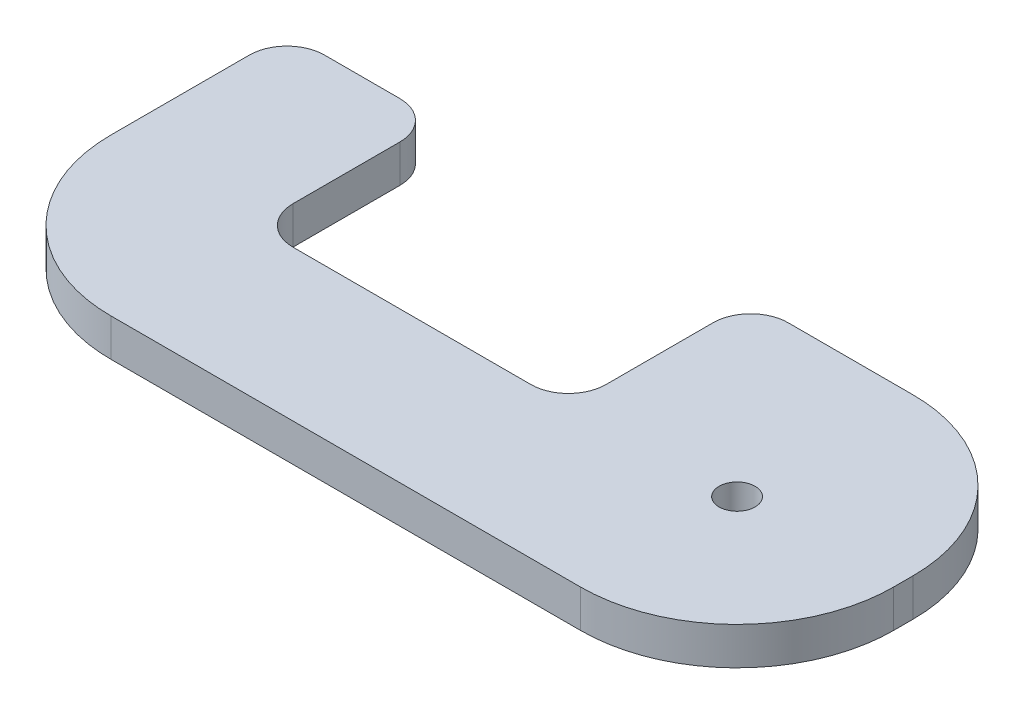
ISO-10303-21;
HEADER;
FILE_DESCRIPTION(('STEP AP214'),'2;1');
FILE_NAME('part.step','',(''),(''),'','','');
FILE_SCHEMA(('AUTOMOTIVE_DESIGN { 1 0 10303 214 1 1 1 1 }'));
ENDSEC;
DATA;
#1=APPLICATION_CONTEXT('core data for automotive mechanical design processes');
#2=APPLICATION_PROTOCOL_DEFINITION('international standard','automotive_design',2000,#1);
#3=PRODUCT_CONTEXT('',#1,'mechanical');
#4=PRODUCT('Part','Part','',(#3));
#5=PRODUCT_RELATED_PRODUCT_CATEGORY('part','',(#4));
#6=PRODUCT_DEFINITION_FORMATION('','',#4);
#7=PRODUCT_DEFINITION_CONTEXT('part definition',#1,'design');
#8=PRODUCT_DEFINITION('design','',#6,#7);
#9=PRODUCT_DEFINITION_SHAPE('','',#8);
#10=(LENGTH_UNIT() NAMED_UNIT(*) SI_UNIT(.MILLI.,.METRE.));
#11=(NAMED_UNIT(*) PLANE_ANGLE_UNIT() SI_UNIT($,.RADIAN.));
#12=(NAMED_UNIT(*) SI_UNIT($,.STERADIAN.) SOLID_ANGLE_UNIT());
#13=UNCERTAINTY_MEASURE_WITH_UNIT(LENGTH_MEASURE(1.E-05),#10,'distance_accuracy_value','');
#14=(GEOMETRIC_REPRESENTATION_CONTEXT(3) GLOBAL_UNCERTAINTY_ASSIGNED_CONTEXT((#13)) GLOBAL_UNIT_ASSIGNED_CONTEXT((#10,
#11,#12)) REPRESENTATION_CONTEXT('',''));
#15=CARTESIAN_POINT('',(0.,0.,0.));
#16=DIRECTION('',(0.,0.,1.));
#17=DIRECTION('',(1.,0.,0.));
#18=AXIS2_PLACEMENT_3D('',#15,#16,#17);
#19=CARTESIAN_POINT('',(-32.8511120004048,3.175,-13.9774845085755));
#20=DIRECTION('',(0.,0.,1.));
#21=DIRECTION('',(1.,0.,0.));
#22=AXIS2_PLACEMENT_3D('',#19,#20,#21);
#23=PLANE('',#22);
#24=DIRECTION('',(-1.,0.,0.));
#25=VECTOR('',#24,1.);
#26=CARTESIAN_POINT('',(-32.8511120004048,0.,-13.9774845085755));
#27=LINE('',#26,#25);
#28=CARTESIAN_POINT('',(19.9808879995952,0.,-13.9774845085755));
#29=VERTEX_POINT('',#28);
#30=CARTESIAN_POINT('',(9.43988799959521,0.,-13.9774845085755));
#31=VERTEX_POINT('',#30);
#32=EDGE_CURVE('E162',#29,#31,#27,.T.);
#33=ORIENTED_EDGE('',*,*,#32,.T.);
#34=DIRECTION('',(0.,1.,0.));
#35=VECTOR('',#34,1.);
#36=CARTESIAN_POINT('',(9.43988799959521,3.175,-13.9774845085755));
#37=LINE('',#36,#35);
#38=CARTESIAN_POINT('',(9.43988799959521,3.175,-13.9774845085755));
#39=VERTEX_POINT('',#38);
#40=EDGE_CURVE('E253',#31,#39,#37,.T.);
#41=ORIENTED_EDGE('',*,*,#40,.T.);
#42=DIRECTION('',(-1.,0.,0.));
#43=VECTOR('',#42,1.);
#44=CARTESIAN_POINT('',(-32.8511120004048,3.175,-13.9774845085755));
#45=LINE('',#44,#43);
#46=CARTESIAN_POINT('',(19.9808879995952,3.175,-13.9774845085755));
#47=VERTEX_POINT('',#46);
#48=EDGE_CURVE('E209',#47,#39,#45,.T.);
#49=ORIENTED_EDGE('',*,*,#48,.F.);
#50=DIRECTION('',(0.,-1.,0.));
#51=VECTOR('',#50,1.);
#52=CARTESIAN_POINT('',(19.9808879995952,3.175,-13.9774845085755));
#53=LINE('',#52,#51);
#54=EDGE_CURVE('E180',#47,#29,#53,.T.);
#55=ORIENTED_EDGE('',*,*,#54,.T.);
#56=EDGE_LOOP('',(#33,#41,#49,#55));
#57=FACE_BOUND('',#56,.T.);
#58=ADVANCED_FACE('F34',(#57),#23,.F.);
#59=CARTESIAN_POINT('',(-32.8511120004048,3.175,-13.9774845085755));
#60=DIRECTION('',(1.,0.,0.));
#61=DIRECTION('',(0.,0.,-1.));
#62=AXIS2_PLACEMENT_3D('',#59,#60,#61);
#63=PLANE('',#62);
#64=DIRECTION('',(0.,0.,1.));
#65=VECTOR('',#64,1.);
#66=CARTESIAN_POINT('',(-32.8511120004048,3.175,-13.9774845085755));
#67=LINE('',#66,#65);
#68=CARTESIAN_POINT('',(-32.8511120004048,3.175,-10.8024845085755));
#69=VERTEX_POINT('',#68);
#70=CARTESIAN_POINT('',(-32.8511120004048,3.175,0.881515491424525));
#71=VERTEX_POINT('',#70);
#72=EDGE_CURVE('E146',#69,#71,#67,.T.);
#73=ORIENTED_EDGE('',*,*,#72,.F.);
#74=DIRECTION('',(0.,-1.,0.));
#75=VECTOR('',#74,1.);
#76=CARTESIAN_POINT('',(-32.8511120004048,3.175,-10.8024845085755));
#77=LINE('',#76,#75);
#78=CARTESIAN_POINT('',(-32.8511120004048,0.,-10.8024845085755));
#79=VERTEX_POINT('',#78);
#80=EDGE_CURVE('E269',#69,#79,#77,.T.);
#81=ORIENTED_EDGE('',*,*,#80,.T.);
#82=DIRECTION('',(0.,0.,1.));
#83=VECTOR('',#82,1.);
#84=CARTESIAN_POINT('',(-32.8511120004048,0.,-13.9774845085755));
#85=LINE('',#84,#83);
#86=CARTESIAN_POINT('',(-32.8511120004048,0.,0.881515491424525));
#87=VERTEX_POINT('',#86);
#88=EDGE_CURVE('E167',#79,#87,#85,.T.);
#89=ORIENTED_EDGE('',*,*,#88,.T.);
#90=DIRECTION('',(0.,-1.,0.));
#91=VECTOR('',#90,1.);
#92=CARTESIAN_POINT('',(-32.8511120004048,3.175,0.881515491424525));
#93=LINE('',#92,#91);
#94=EDGE_CURVE('E165',#87,#71,#93,.F.);
#95=ORIENTED_EDGE('',*,*,#94,.T.);
#96=EDGE_LOOP('',(#73,#81,#89,#95));
#97=FACE_BOUND('',#96,.T.);
#98=ADVANCED_FACE('F166',(#97),#63,.F.);
#99=CARTESIAN_POINT('',(-32.8511120004048,3.175,14.0895154914245));
#100=DIRECTION('',(0.,0.,-1.));
#101=DIRECTION('',(-1.,0.,0.));
#102=AXIS2_PLACEMENT_3D('',#99,#100,#101);
#103=PLANE('',#102);
#104=DIRECTION('',(1.,0.,0.));
#105=VECTOR('',#104,1.);
#106=CARTESIAN_POINT('',(-32.8511120004048,3.175,14.0895154914245));
#107=LINE('',#106,#105);
#108=CARTESIAN_POINT('',(-19.6431120004048,3.175,14.0895154914245));
#109=VERTEX_POINT('',#108);
#110=CARTESIAN_POINT('',(19.9808879995952,3.175,14.0895154914245));
#111=VERTEX_POINT('',#110);
#112=EDGE_CURVE('E161',#109,#111,#107,.T.);
#113=ORIENTED_EDGE('',*,*,#112,.F.);
#114=DIRECTION('',(0.,-1.,0.));
#115=VECTOR('',#114,1.);
#116=CARTESIAN_POINT('',(-19.6431120004048,3.175,14.0895154914245));
#117=LINE('',#116,#115);
#118=CARTESIAN_POINT('',(-19.6431120004048,0.,14.0895154914245));
#119=VERTEX_POINT('',#118);
#120=EDGE_CURVE('E176',#109,#119,#117,.T.);
#121=ORIENTED_EDGE('',*,*,#120,.T.);
#122=DIRECTION('',(1.,0.,0.));
#123=VECTOR('',#122,1.);
#124=CARTESIAN_POINT('',(-32.8511120004048,0.,14.0895154914245));
#125=LINE('',#124,#123);
#126=CARTESIAN_POINT('',(19.9808879995952,0.,14.0895154914245));
#127=VERTEX_POINT('',#126);
#128=EDGE_CURVE('E204',#119,#127,#125,.T.);
#129=ORIENTED_EDGE('',*,*,#128,.T.);
#130=DIRECTION('',(0.,-1.,0.));
#131=VECTOR('',#130,1.);
#132=CARTESIAN_POINT('',(19.9808879995952,3.175,14.0895154914245));
#133=LINE('',#132,#131);
#134=EDGE_CURVE('E203',#127,#111,#133,.F.);
#135=ORIENTED_EDGE('',*,*,#134,.T.);
#136=EDGE_LOOP('',(#113,#121,#129,#135));
#137=FACE_BOUND('',#136,.T.);
#138=ADVANCED_FACE('F326',(#137),#103,.F.);
#139=CARTESIAN_POINT('',(33.1888879995952,3.175,-13.9774845085755));
#140=DIRECTION('',(-1.,0.,0.));
#141=DIRECTION('',(0.,0.,1.));
#142=AXIS2_PLACEMENT_3D('',#139,#140,#141);
#143=PLANE('',#142);
#144=DIRECTION('',(0.,0.,-1.));
#145=VECTOR('',#144,1.);
#146=CARTESIAN_POINT('',(33.1888879995952,0.,-13.9774845085755));
#147=LINE('',#146,#145);
#148=CARTESIAN_POINT('',(33.1888879995952,0.,0.881515491424518));
#149=VERTEX_POINT('',#148);
#150=CARTESIAN_POINT('',(33.1888879995952,0.,-0.76948450857548));
#151=VERTEX_POINT('',#150);
#152=EDGE_CURVE('E207',#149,#151,#147,.T.);
#153=ORIENTED_EDGE('',*,*,#152,.T.);
#154=DIRECTION('',(0.,-1.,0.));
#155=VECTOR('',#154,1.);
#156=CARTESIAN_POINT('',(33.1888879995952,3.175,-0.76948450857548));
#157=LINE('',#156,#155);
#158=CARTESIAN_POINT('',(33.1888879995952,3.175,-0.76948450857548));
#159=VERTEX_POINT('',#158);
#160=EDGE_CURVE('E218',#151,#159,#157,.F.);
#161=ORIENTED_EDGE('',*,*,#160,.T.);
#162=DIRECTION('',(0.,0.,-1.));
#163=VECTOR('',#162,1.);
#164=CARTESIAN_POINT('',(33.1888879995952,3.175,-13.9774845085755));
#165=LINE('',#164,#163);
#166=CARTESIAN_POINT('',(33.1888879995952,3.175,0.881515491424518));
#167=VERTEX_POINT('',#166);
#168=EDGE_CURVE('E194',#167,#159,#165,.T.);
#169=ORIENTED_EDGE('',*,*,#168,.F.);
#170=DIRECTION('',(0.,-1.,0.));
#171=VECTOR('',#170,1.);
#172=CARTESIAN_POINT('',(33.1888879995952,3.175,0.881515491424518));
#173=LINE('',#172,#171);
#174=EDGE_CURVE('E177',#167,#149,#173,.T.);
#175=ORIENTED_EDGE('',*,*,#174,.T.);
#176=EDGE_LOOP('',(#153,#161,#169,#175));
#177=FACE_BOUND('',#176,.T.);
#178=ADVANCED_FACE('F334',(#177),#143,.F.);
#179=CARTESIAN_POINT('',(-23.3261120004048,3.175,-13.9774845085755));
#180=VERTEX_POINT('',#179);
#181=CARTESIAN_POINT('',(-29.6761120004048,3.175,-13.9774845085755));
#182=VERTEX_POINT('',#181);
#183=EDGE_CURVE('E312',#180,#182,#45,.T.);
#184=ORIENTED_EDGE('',*,*,#183,.F.);
#185=DIRECTION('',(0.,1.,0.));
#186=VECTOR('',#185,1.);
#187=CARTESIAN_POINT('',(-23.3261120004048,3.175,-13.9774845085755));
#188=LINE('',#187,#186);
#189=CARTESIAN_POINT('',(-23.3261120004048,0.,-13.9774845085755));
#190=VERTEX_POINT('',#189);
#191=EDGE_CURVE('E56',#180,#190,#188,.F.);
#192=ORIENTED_EDGE('',*,*,#191,.T.);
#193=CARTESIAN_POINT('',(-29.6761120004048,0.,-13.9774845085755));
#194=VERTEX_POINT('',#193);
#195=EDGE_CURVE('E224',#190,#194,#27,.T.);
#196=ORIENTED_EDGE('',*,*,#195,.T.);
#197=DIRECTION('',(0.,-1.,0.));
#198=VECTOR('',#197,1.);
#199=CARTESIAN_POINT('',(-29.6761120004048,3.175,-13.9774845085755));
#200=LINE('',#199,#198);
#201=EDGE_CURVE('E266',#194,#182,#200,.F.);
#202=ORIENTED_EDGE('',*,*,#201,.T.);
#203=EDGE_LOOP('',(#184,#192,#196,#202));
#204=FACE_BOUND('',#203,.T.);
#205=ADVANCED_FACE('F357',(#204),#23,.F.);
#206=CARTESIAN_POINT('',(0.1688879995952,3.175,0.0560154914245228));
#207=DIRECTION('',(0.,1.,0.));
#208=DIRECTION('',(0.,0.,1.));
#209=AXIS2_PLACEMENT_3D('',#206,#207,#208);
#210=PLANE('',#209);
#211=ORIENTED_EDGE('',*,*,#48,.T.);
#212=CARTESIAN_POINT('',(9.43988799959521,3.175,-10.8024845085755));
#213=DIRECTION('',(0.,1.,0.));
#214=DIRECTION('',(0.,0.,1.));
#215=AXIS2_PLACEMENT_3D('',#212,#213,#214);
#216=CIRCLE('',#215,3.175);
#217=CARTESIAN_POINT('',(6.26488799959521,3.175,-10.8024845085755));
#218=VERTEX_POINT('',#217);
#219=EDGE_CURVE('E259',#39,#218,#216,.T.);
#220=ORIENTED_EDGE('',*,*,#219,.T.);
#221=DIRECTION('',(0.,0.,-1.));
#222=VECTOR('',#221,1.);
#223=CARTESIAN_POINT('',(6.26488799959521,3.175,-13.9774845085755));
#224=LINE('',#223,#222);
#225=CARTESIAN_POINT('',(6.26488799959521,3.175,-1.78548450857548));
#226=VERTEX_POINT('',#225);
#227=EDGE_CURVE('E279',#226,#218,#224,.T.);
#228=ORIENTED_EDGE('',*,*,#227,.F.);
#229=CARTESIAN_POINT('',(3.08988799959521,3.175,-1.78548450857548));
#230=DIRECTION('',(0.,1.,0.));
#231=DIRECTION('',(0.,0.,1.));
#232=AXIS2_PLACEMENT_3D('',#229,#230,#231);
#233=CIRCLE('',#232,3.175);
#234=CARTESIAN_POINT('',(3.08988799959521,3.175,1.38951549142452));
#235=VERTEX_POINT('',#234);
#236=EDGE_CURVE('E42',#226,#235,#233,.F.);
#237=ORIENTED_EDGE('',*,*,#236,.T.);
#238=DIRECTION('',(1.,0.,0.));
#239=VECTOR('',#238,1.);
#240=CARTESIAN_POINT('',(6.26488799959521,3.175,1.38951549142452));
#241=LINE('',#240,#239);
#242=CARTESIAN_POINT('',(-16.9761120004048,3.175,1.38951549142452));
#243=VERTEX_POINT('',#242);
#244=EDGE_CURVE('E277',#243,#235,#241,.T.);
#245=ORIENTED_EDGE('',*,*,#244,.F.);
#246=CARTESIAN_POINT('',(-16.9761120004048,3.175,-1.78548450857548));
#247=DIRECTION('',(0.,1.,0.));
#248=DIRECTION('',(0.,0.,1.));
#249=AXIS2_PLACEMENT_3D('',#246,#247,#248);
#250=CIRCLE('',#249,3.175);
#251=CARTESIAN_POINT('',(-20.1511120004048,3.175,-1.78548450857547));
#252=VERTEX_POINT('',#251);
#253=EDGE_CURVE('E271',#243,#252,#250,.F.);
#254=ORIENTED_EDGE('',*,*,#253,.T.);
#255=DIRECTION('',(0.,0.,1.));
#256=VECTOR('',#255,1.);
#257=CARTESIAN_POINT('',(-20.1511120004048,3.175,-13.9774845085755));
#258=LINE('',#257,#256);
#259=CARTESIAN_POINT('',(-20.1511120004048,3.175,-10.8024845085755));
#260=VERTEX_POINT('',#259);
#261=EDGE_CURVE('E289',#260,#252,#258,.T.);
#262=ORIENTED_EDGE('',*,*,#261,.F.);
#263=CARTESIAN_POINT('',(-23.3261120004048,3.175,-10.8024845085755));
#264=DIRECTION('',(0.,1.,0.));
#265=DIRECTION('',(0.,0.,1.));
#266=AXIS2_PLACEMENT_3D('',#263,#264,#265);
#267=CIRCLE('',#266,3.175);
#268=EDGE_CURVE('E257',#260,#180,#267,.T.);
#269=ORIENTED_EDGE('',*,*,#268,.T.);
#270=ORIENTED_EDGE('',*,*,#183,.T.);
#271=CARTESIAN_POINT('',(-29.6761120004048,3.175,-10.8024845085755));
#272=DIRECTION('',(0.,1.,0.));
#273=DIRECTION('',(0.,0.,1.));
#274=AXIS2_PLACEMENT_3D('',#271,#272,#273);
#275=CIRCLE('',#274,3.175);
#276=EDGE_CURVE('E157',#182,#69,#275,.T.);
#277=ORIENTED_EDGE('',*,*,#276,.T.);
#278=ORIENTED_EDGE('',*,*,#72,.T.);
#279=CARTESIAN_POINT('',(-32.8511120004048,3.175,0.881515491424518));
#280=CARTESIAN_POINT('',(-32.8511120004048,3.175,8.61858275960068));
#281=CARTESIAN_POINT('',(-27.380179268581,3.175,14.0895154914245));
#282=CARTESIAN_POINT('',(-19.6431120004048,3.175,14.0895154914245));
#283=(BOUNDED_CURVE() B_SPLINE_CURVE(3,(#279,#280,#281,#282),.UNSPECIFIED.,.F.,
.F.) B_SPLINE_CURVE_WITH_KNOTS((4,4),(0.,1.),
.UNSPECIFIED.) CURVE() GEOMETRIC_REPRESENTATION_ITEM() RATIONAL_B_SPLINE_CURVE((1.,
0.804737854124365,0.804737854124365,1.)) REPRESENTATION_ITEM(''));
#284=EDGE_CURVE('E153',#71,#109,#283,.T.);
#285=ORIENTED_EDGE('',*,*,#284,.T.);
#286=ORIENTED_EDGE('',*,*,#112,.T.);
#287=CARTESIAN_POINT('',(19.9808879995952,3.175,14.0895154914245));
#288=CARTESIAN_POINT('',(27.7179552677714,3.175,14.0895154914245));
#289=CARTESIAN_POINT('',(33.1888879995952,3.175,8.61858275960068));
#290=CARTESIAN_POINT('',(33.1888879995952,3.175,0.881515491424519));
#291=(BOUNDED_CURVE() B_SPLINE_CURVE(3,(#287,#288,#289,#290),.UNSPECIFIED.,.F.,
.F.) B_SPLINE_CURVE_WITH_KNOTS((4,4),(0.,1.),
.UNSPECIFIED.) CURVE() GEOMETRIC_REPRESENTATION_ITEM() RATIONAL_B_SPLINE_CURVE((1.,
0.804737854124365,0.804737854124365,1.)) REPRESENTATION_ITEM(''));
#292=EDGE_CURVE('E170',#111,#167,#291,.T.);
#293=ORIENTED_EDGE('',*,*,#292,.T.);
#294=ORIENTED_EDGE('',*,*,#168,.T.);
#295=CARTESIAN_POINT('',(33.1888879995952,3.175,-0.76948450857548));
#296=CARTESIAN_POINT('',(33.1888879995952,3.175,-8.50655177675164));
#297=CARTESIAN_POINT('',(27.7179552677714,3.175,-13.9774845085755));
#298=CARTESIAN_POINT('',(19.9808879995952,3.175,-13.9774845085755));
#299=(BOUNDED_CURVE() B_SPLINE_CURVE(3,(#295,#296,#297,#298),.UNSPECIFIED.,.F.,
.F.) B_SPLINE_CURVE_WITH_KNOTS((4,4),(0.,1.),
.UNSPECIFIED.) CURVE() GEOMETRIC_REPRESENTATION_ITEM() RATIONAL_B_SPLINE_CURVE((1.,
0.804737854124365,0.804737854124365,1.)) REPRESENTATION_ITEM(''));
#300=EDGE_CURVE('E187',#159,#47,#299,.T.);
#301=ORIENTED_EDGE('',*,*,#300,.T.);
#302=EDGE_LOOP('',(#211,#220,#228,#237,#245,#254,#262,#269,#270,#277,#278,#285,#286,#293,#294,#301));
#303=FACE_BOUND('',#302,.T.);
#304=CARTESIAN_POINT('',(19.9808879995952,3.175,0.881515491424521));
#305=DIRECTION('',(0.,1.,0.));
#306=DIRECTION('',(0.,0.,1.));
#307=AXIS2_PLACEMENT_3D('',#304,#305,#306);
#308=CIRCLE('',#307,1.517269);
#309=CARTESIAN_POINT('',(19.9808879995952,3.175,2.39878449142452));
#310=VERTEX_POINT('',#309);
#311=EDGE_CURVE('E213',#310,#310,#308,.T.);
#312=ORIENTED_EDGE('',*,*,#311,.F.);
#313=EDGE_LOOP('',(#312));
#314=FACE_BOUND('',#313,.T.);
#315=ADVANCED_FACE('F149',(#303,#314),#210,.T.);
#316=CARTESIAN_POINT('',(0.1688879995952,0.,0.0560154914245228));
#317=DIRECTION('',(0.,1.,0.));
#318=DIRECTION('',(0.,0.,1.));
#319=AXIS2_PLACEMENT_3D('',#316,#317,#318);
#320=PLANE('',#319);
#321=CARTESIAN_POINT('',(19.9808879995952,0.,0.881515491424521));
#322=DIRECTION('',(0.,1.,0.));
#323=DIRECTION('',(0.,0.,1.));
#324=AXIS2_PLACEMENT_3D('',#321,#322,#323);
#325=CIRCLE('',#324,1.517269);
#326=CARTESIAN_POINT('',(19.9808879995952,0.,2.39878449142452));
#327=VERTEX_POINT('',#326);
#328=EDGE_CURVE('E210',#327,#327,#325,.T.);
#329=ORIENTED_EDGE('',*,*,#328,.T.);
#330=EDGE_LOOP('',(#329));
#331=FACE_BOUND('',#330,.T.);
#332=DIRECTION('',(0.,0.,-1.));
#333=VECTOR('',#332,1.);
#334=CARTESIAN_POINT('',(6.26488799959521,0.,-13.9774845085755));
#335=LINE('',#334,#333);
#336=CARTESIAN_POINT('',(6.26488799959521,0.,-1.78548450857548));
#337=VERTEX_POINT('',#336);
#338=CARTESIAN_POINT('',(6.26488799959521,0.,-10.8024845085755));
#339=VERTEX_POINT('',#338);
#340=EDGE_CURVE('E288',#337,#339,#335,.T.);
#341=ORIENTED_EDGE('',*,*,#340,.T.);
#342=CARTESIAN_POINT('',(9.43988799959521,0.,-10.8024845085755));
#343=DIRECTION('',(0.,1.,0.));
#344=DIRECTION('',(0.,0.,1.));
#345=AXIS2_PLACEMENT_3D('',#342,#343,#344);
#346=CIRCLE('',#345,3.175);
#347=EDGE_CURVE('E264',#339,#31,#346,.F.);
#348=ORIENTED_EDGE('',*,*,#347,.T.);
#349=ORIENTED_EDGE('',*,*,#32,.F.);
#350=CARTESIAN_POINT('',(33.1888879995952,0.,-0.76948450857548));
#351=CARTESIAN_POINT('',(33.1888879995952,0.,-8.50655177675164));
#352=CARTESIAN_POINT('',(27.7179552677714,0.,-13.9774845085755));
#353=CARTESIAN_POINT('',(19.9808879995952,0.,-13.9774845085755));
#354=(BOUNDED_CURVE() B_SPLINE_CURVE(3,(#350,#351,#352,#353),.UNSPECIFIED.,.F.,
.F.) B_SPLINE_CURVE_WITH_KNOTS((4,4),(0.,1.),
.UNSPECIFIED.) CURVE() GEOMETRIC_REPRESENTATION_ITEM() RATIONAL_B_SPLINE_CURVE((1.,
0.804737854124365,0.804737854124365,1.)) REPRESENTATION_ITEM(''));
#355=EDGE_CURVE('E214',#29,#151,#354,.F.);
#356=ORIENTED_EDGE('',*,*,#355,.T.);
#357=ORIENTED_EDGE('',*,*,#152,.F.);
#358=CARTESIAN_POINT('',(19.9808879995952,0.,14.0895154914245));
#359=CARTESIAN_POINT('',(27.7179552677714,0.,14.0895154914245));
#360=CARTESIAN_POINT('',(33.1888879995952,0.,8.61858275960068));
#361=CARTESIAN_POINT('',(33.1888879995952,0.,0.881515491424519));
#362=(BOUNDED_CURVE() B_SPLINE_CURVE(3,(#358,#359,#360,#361),.UNSPECIFIED.,.F.,
.F.) B_SPLINE_CURVE_WITH_KNOTS((4,4),(0.,1.),
.UNSPECIFIED.) CURVE() GEOMETRIC_REPRESENTATION_ITEM() RATIONAL_B_SPLINE_CURVE((1.,
0.804737854124365,0.804737854124365,1.)) REPRESENTATION_ITEM(''));
#363=EDGE_CURVE('E202',#149,#127,#362,.F.);
#364=ORIENTED_EDGE('',*,*,#363,.T.);
#365=ORIENTED_EDGE('',*,*,#128,.F.);
#366=CARTESIAN_POINT('',(-32.8511120004048,0.,0.881515491424518));
#367=CARTESIAN_POINT('',(-32.8511120004048,0.,8.61858275960068));
#368=CARTESIAN_POINT('',(-27.380179268581,0.,14.0895154914245));
#369=CARTESIAN_POINT('',(-19.6431120004048,0.,14.0895154914245));
#370=(BOUNDED_CURVE() B_SPLINE_CURVE(3,(#366,#367,#368,#369),.UNSPECIFIED.,.F.,
.F.) B_SPLINE_CURVE_WITH_KNOTS((4,4),(0.,1.),
.UNSPECIFIED.) CURVE() GEOMETRIC_REPRESENTATION_ITEM() RATIONAL_B_SPLINE_CURVE((1.,
0.804737854124365,0.804737854124365,1.)) REPRESENTATION_ITEM(''));
#371=EDGE_CURVE('E171',#119,#87,#370,.F.);
#372=ORIENTED_EDGE('',*,*,#371,.T.);
#373=ORIENTED_EDGE('',*,*,#88,.F.);
#374=CARTESIAN_POINT('',(-29.6761120004048,0.,-10.8024845085755));
#375=DIRECTION('',(0.,1.,0.));
#376=DIRECTION('',(0.,0.,1.));
#377=AXIS2_PLACEMENT_3D('',#374,#375,#376);
#378=CIRCLE('',#377,3.175);
#379=EDGE_CURVE('E49',#79,#194,#378,.F.);
#380=ORIENTED_EDGE('',*,*,#379,.T.);
#381=ORIENTED_EDGE('',*,*,#195,.F.);
#382=CARTESIAN_POINT('',(-23.3261120004048,0.,-10.8024845085755));
#383=DIRECTION('',(0.,1.,0.));
#384=DIRECTION('',(0.,0.,1.));
#385=AXIS2_PLACEMENT_3D('',#382,#383,#384);
#386=CIRCLE('',#385,3.175);
#387=CARTESIAN_POINT('',(-20.1511120004048,0.,-10.8024845085755));
#388=VERTEX_POINT('',#387);
#389=EDGE_CURVE('E262',#190,#388,#386,.F.);
#390=ORIENTED_EDGE('',*,*,#389,.T.);
#391=DIRECTION('',(0.,0.,1.));
#392=VECTOR('',#391,1.);
#393=CARTESIAN_POINT('',(-20.1511120004048,0.,-13.9774845085755));
#394=LINE('',#393,#392);
#395=CARTESIAN_POINT('',(-20.1511120004048,0.,-1.78548450857547));
#396=VERTEX_POINT('',#395);
#397=EDGE_CURVE('E301',#388,#396,#394,.T.);
#398=ORIENTED_EDGE('',*,*,#397,.T.);
#399=CARTESIAN_POINT('',(-16.9761120004048,0.,-1.78548450857548));
#400=DIRECTION('',(0.,1.,0.));
#401=DIRECTION('',(0.,0.,1.));
#402=AXIS2_PLACEMENT_3D('',#399,#400,#401);
#403=CIRCLE('',#402,3.175);
#404=CARTESIAN_POINT('',(-16.9761120004048,0.,1.38951549142452));
#405=VERTEX_POINT('',#404);
#406=EDGE_CURVE('E273',#396,#405,#403,.T.);
#407=ORIENTED_EDGE('',*,*,#406,.T.);
#408=DIRECTION('',(1.,0.,0.));
#409=VECTOR('',#408,1.);
#410=CARTESIAN_POINT('',(6.26488799959521,0.,1.38951549142452));
#411=LINE('',#410,#409);
#412=CARTESIAN_POINT('',(3.08988799959521,0.,1.38951549142452));
#413=VERTEX_POINT('',#412);
#414=EDGE_CURVE('E297',#405,#413,#411,.T.);
#415=ORIENTED_EDGE('',*,*,#414,.T.);
#416=CARTESIAN_POINT('',(3.08988799959521,0.,-1.78548450857548));
#417=DIRECTION('',(0.,1.,0.));
#418=DIRECTION('',(0.,0.,1.));
#419=AXIS2_PLACEMENT_3D('',#416,#417,#418);
#420=CIRCLE('',#419,3.175);
#421=EDGE_CURVE('E11',#413,#337,#420,.T.);
#422=ORIENTED_EDGE('',*,*,#421,.T.);
#423=EDGE_LOOP('',(#341,#348,#349,#356,#357,#364,#365,#372,#373,#380,#381,#390,#398,#407,#415,#422));
#424=FACE_BOUND('',#423,.T.);
#425=ADVANCED_FACE('F295',(#331,#424),#320,.F.);
#426=CARTESIAN_POINT('',(-19.6431120004048,3.175,0.88151549142452));
#427=DIRECTION('',(0.,-1.,0.));
#428=DIRECTION('',(0.,0.,-1.));
#429=AXIS2_PLACEMENT_3D('',#426,#427,#428);
#430=CYLINDRICAL_SURFACE('',#429,13.208);
#431=ORIENTED_EDGE('',*,*,#284,.F.);
#432=ORIENTED_EDGE('',*,*,#94,.F.);
#433=ORIENTED_EDGE('',*,*,#371,.F.);
#434=ORIENTED_EDGE('',*,*,#120,.F.);
#435=EDGE_LOOP('',(#431,#432,#433,#434));
#436=FACE_BOUND('',#435,.T.);
#437=ADVANCED_FACE('F174',(#436),#430,.T.);
#438=CARTESIAN_POINT('',(19.9808879995952,3.175,0.88151549142452));
#439=DIRECTION('',(0.,-1.,0.));
#440=DIRECTION('',(0.,0.,-1.));
#441=AXIS2_PLACEMENT_3D('',#438,#439,#440);
#442=CYLINDRICAL_SURFACE('',#441,13.208);
#443=ORIENTED_EDGE('',*,*,#292,.F.);
#444=ORIENTED_EDGE('',*,*,#134,.F.);
#445=ORIENTED_EDGE('',*,*,#363,.F.);
#446=ORIENTED_EDGE('',*,*,#174,.F.);
#447=EDGE_LOOP('',(#443,#444,#445,#446));
#448=FACE_BOUND('',#447,.T.);
#449=ADVANCED_FACE('F331',(#448),#442,.T.);
#450=CARTESIAN_POINT('',(19.9808879995952,0.,0.881515491424521));
#451=DIRECTION('',(0.,1.,0.));
#452=DIRECTION('',(0.,0.,1.));
#453=AXIS2_PLACEMENT_3D('',#450,#451,#452);
#454=CYLINDRICAL_SURFACE('',#453,1.517269);
#455=ORIENTED_EDGE('',*,*,#328,.F.);
#456=EDGE_LOOP('',(#455));
#457=FACE_BOUND('',#456,.T.);
#458=ORIENTED_EDGE('',*,*,#311,.T.);
#459=EDGE_LOOP('',(#458));
#460=FACE_BOUND('',#459,.T.);
#461=ADVANCED_FACE('F443',(#457,#460),#454,.F.);
#462=CARTESIAN_POINT('',(19.9808879995952,3.175,-0.769484508575478));
#463=DIRECTION('',(0.,-1.,0.));
#464=DIRECTION('',(0.,0.,-1.));
#465=AXIS2_PLACEMENT_3D('',#462,#463,#464);
#466=CYLINDRICAL_SURFACE('',#465,13.208);
#467=ORIENTED_EDGE('',*,*,#300,.F.);
#468=ORIENTED_EDGE('',*,*,#160,.F.);
#469=ORIENTED_EDGE('',*,*,#355,.F.);
#470=ORIENTED_EDGE('',*,*,#54,.F.);
#471=EDGE_LOOP('',(#467,#468,#469,#470));
#472=FACE_BOUND('',#471,.T.);
#473=ADVANCED_FACE('F339',(#472),#466,.T.);
#474=CARTESIAN_POINT('',(6.26488799959521,0.,-13.9774845085755));
#475=DIRECTION('',(1.,0.,0.));
#476=DIRECTION('',(0.,0.,-1.));
#477=AXIS2_PLACEMENT_3D('',#474,#475,#476);
#478=PLANE('',#477);
#479=ORIENTED_EDGE('',*,*,#340,.F.);
#480=DIRECTION('',(0.,1.,0.));
#481=VECTOR('',#480,1.);
#482=CARTESIAN_POINT('',(6.26488799959521,3.175,-1.78548450857548));
#483=LINE('',#482,#481);
#484=EDGE_CURVE('E250',#337,#226,#483,.T.);
#485=ORIENTED_EDGE('',*,*,#484,.T.);
#486=ORIENTED_EDGE('',*,*,#227,.T.);
#487=DIRECTION('',(0.,1.,0.));
#488=VECTOR('',#487,1.);
#489=CARTESIAN_POINT('',(6.26488799959521,0.,-10.8024845085755));
#490=LINE('',#489,#488);
#491=EDGE_CURVE('E248',#218,#339,#490,.F.);
#492=ORIENTED_EDGE('',*,*,#491,.T.);
#493=EDGE_LOOP('',(#479,#485,#486,#492));
#494=FACE_BOUND('',#493,.T.);
#495=ADVANCED_FACE('F299',(#494),#478,.F.);
#496=CARTESIAN_POINT('',(6.26488799959521,0.,1.38951549142452));
#497=DIRECTION('',(0.,0.,1.));
#498=DIRECTION('',(1.,0.,0.));
#499=AXIS2_PLACEMENT_3D('',#496,#497,#498);
#500=PLANE('',#499);
#501=ORIENTED_EDGE('',*,*,#414,.F.);
#502=DIRECTION('',(0.,1.,0.));
#503=VECTOR('',#502,1.);
#504=CARTESIAN_POINT('',(-16.9761120004048,3.175,1.38951549142452));
#505=LINE('',#504,#503);
#506=EDGE_CURVE('E240',#405,#243,#505,.T.);
#507=ORIENTED_EDGE('',*,*,#506,.T.);
#508=ORIENTED_EDGE('',*,*,#244,.T.);
#509=DIRECTION('',(0.,1.,0.));
#510=VECTOR('',#509,1.);
#511=CARTESIAN_POINT('',(3.08988799959521,0.,1.38951549142452));
#512=LINE('',#511,#510);
#513=EDGE_CURVE('E238',#235,#413,#512,.F.);
#514=ORIENTED_EDGE('',*,*,#513,.T.);
#515=EDGE_LOOP('',(#501,#507,#508,#514));
#516=FACE_BOUND('',#515,.T.);
#517=ADVANCED_FACE('F285',(#516),#500,.F.);
#518=CARTESIAN_POINT('',(-20.1511120004048,0.,-13.9774845085755));
#519=DIRECTION('',(-1.,0.,0.));
#520=DIRECTION('',(0.,0.,1.));
#521=AXIS2_PLACEMENT_3D('',#518,#519,#520);
#522=PLANE('',#521);
#523=ORIENTED_EDGE('',*,*,#261,.T.);
#524=DIRECTION('',(0.,1.,0.));
#525=VECTOR('',#524,1.);
#526=CARTESIAN_POINT('',(-20.1511120004048,0.,-1.78548450857547));
#527=LINE('',#526,#525);
#528=EDGE_CURVE('E246',#252,#396,#527,.F.);
#529=ORIENTED_EDGE('',*,*,#528,.T.);
#530=ORIENTED_EDGE('',*,*,#397,.F.);
#531=DIRECTION('',(0.,1.,0.));
#532=VECTOR('',#531,1.);
#533=CARTESIAN_POINT('',(-20.1511120004048,0.,-10.8024845085755));
#534=LINE('',#533,#532);
#535=EDGE_CURVE('E243',#388,#260,#534,.T.);
#536=ORIENTED_EDGE('',*,*,#535,.T.);
#537=EDGE_LOOP('',(#523,#529,#530,#536));
#538=FACE_BOUND('',#537,.T.);
#539=ADVANCED_FACE('F376',(#538),#522,.F.);
#540=CARTESIAN_POINT('',(-16.9761120004048,0.,-1.78548450857548));
#541=DIRECTION('',(0.,-1.,0.));
#542=DIRECTION('',(0.,0.,-1.));
#543=AXIS2_PLACEMENT_3D('',#540,#541,#542);
#544=CYLINDRICAL_SURFACE('',#543,3.175);
#545=ORIENTED_EDGE('',*,*,#406,.F.);
#546=ORIENTED_EDGE('',*,*,#528,.F.);
#547=ORIENTED_EDGE('',*,*,#253,.F.);
#548=ORIENTED_EDGE('',*,*,#506,.F.);
#549=EDGE_LOOP('',(#545,#546,#547,#548));
#550=FACE_BOUND('',#549,.T.);
#551=ADVANCED_FACE('F353',(#550),#544,.F.);
#552=CARTESIAN_POINT('',(3.08988799959521,0.,-1.78548450857548));
#553=DIRECTION('',(0.,-1.,0.));
#554=DIRECTION('',(0.,0.,-1.));
#555=AXIS2_PLACEMENT_3D('',#552,#553,#554);
#556=CYLINDRICAL_SURFACE('',#555,3.175);
#557=ORIENTED_EDGE('',*,*,#421,.F.);
#558=ORIENTED_EDGE('',*,*,#513,.F.);
#559=ORIENTED_EDGE('',*,*,#236,.F.);
#560=ORIENTED_EDGE('',*,*,#484,.F.);
#561=EDGE_LOOP('',(#557,#558,#559,#560));
#562=FACE_BOUND('',#561,.T.);
#563=ADVANCED_FACE('F292',(#562),#556,.F.);
#564=CARTESIAN_POINT('',(9.43988799959521,3.175,-10.8024845085755));
#565=DIRECTION('',(0.,1.,0.));
#566=DIRECTION('',(0.,0.,1.));
#567=AXIS2_PLACEMENT_3D('',#564,#565,#566);
#568=CYLINDRICAL_SURFACE('',#567,3.175);
#569=ORIENTED_EDGE('',*,*,#347,.F.);
#570=ORIENTED_EDGE('',*,*,#491,.F.);
#571=ORIENTED_EDGE('',*,*,#219,.F.);
#572=ORIENTED_EDGE('',*,*,#40,.F.);
#573=EDGE_LOOP('',(#569,#570,#571,#572));
#574=FACE_BOUND('',#573,.T.);
#575=ADVANCED_FACE('F344',(#574),#568,.T.);
#576=CARTESIAN_POINT('',(-23.3261120004048,0.,-10.8024845085755));
#577=DIRECTION('',(0.,1.,0.));
#578=DIRECTION('',(0.,0.,1.));
#579=AXIS2_PLACEMENT_3D('',#576,#577,#578);
#580=CYLINDRICAL_SURFACE('',#579,3.175);
#581=ORIENTED_EDGE('',*,*,#389,.F.);
#582=ORIENTED_EDGE('',*,*,#191,.F.);
#583=ORIENTED_EDGE('',*,*,#268,.F.);
#584=ORIENTED_EDGE('',*,*,#535,.F.);
#585=EDGE_LOOP('',(#581,#582,#583,#584));
#586=FACE_BOUND('',#585,.T.);
#587=ADVANCED_FACE('F346',(#586),#580,.T.);
#588=CARTESIAN_POINT('',(-29.6761120004048,3.175,-10.8024845085755));
#589=DIRECTION('',(0.,-1.,0.));
#590=DIRECTION('',(0.,0.,-1.));
#591=AXIS2_PLACEMENT_3D('',#588,#589,#590);
#592=CYLINDRICAL_SURFACE('',#591,3.175);
#593=ORIENTED_EDGE('',*,*,#276,.F.);
#594=ORIENTED_EDGE('',*,*,#201,.F.);
#595=ORIENTED_EDGE('',*,*,#379,.F.);
#596=ORIENTED_EDGE('',*,*,#80,.F.);
#597=EDGE_LOOP('',(#593,#594,#595,#596));
#598=FACE_BOUND('',#597,.T.);
#599=ADVANCED_FACE('F36',(#598),#592,.T.);
#600=CLOSED_SHELL('',(#58,#98,#138,#178,#205,#315,#425,#437,#449,#461,#473,#495,#517,#539,#551,
#563,#575,#587,#599));
#601=MANIFOLD_SOLID_BREP('B2',#600);
#602=ADVANCED_BREP_SHAPE_REPRESENTATION('',(#18,#601),#14);
#603=SHAPE_DEFINITION_REPRESENTATION(#9,#602);
ENDSEC;
END-ISO-10303-21;
